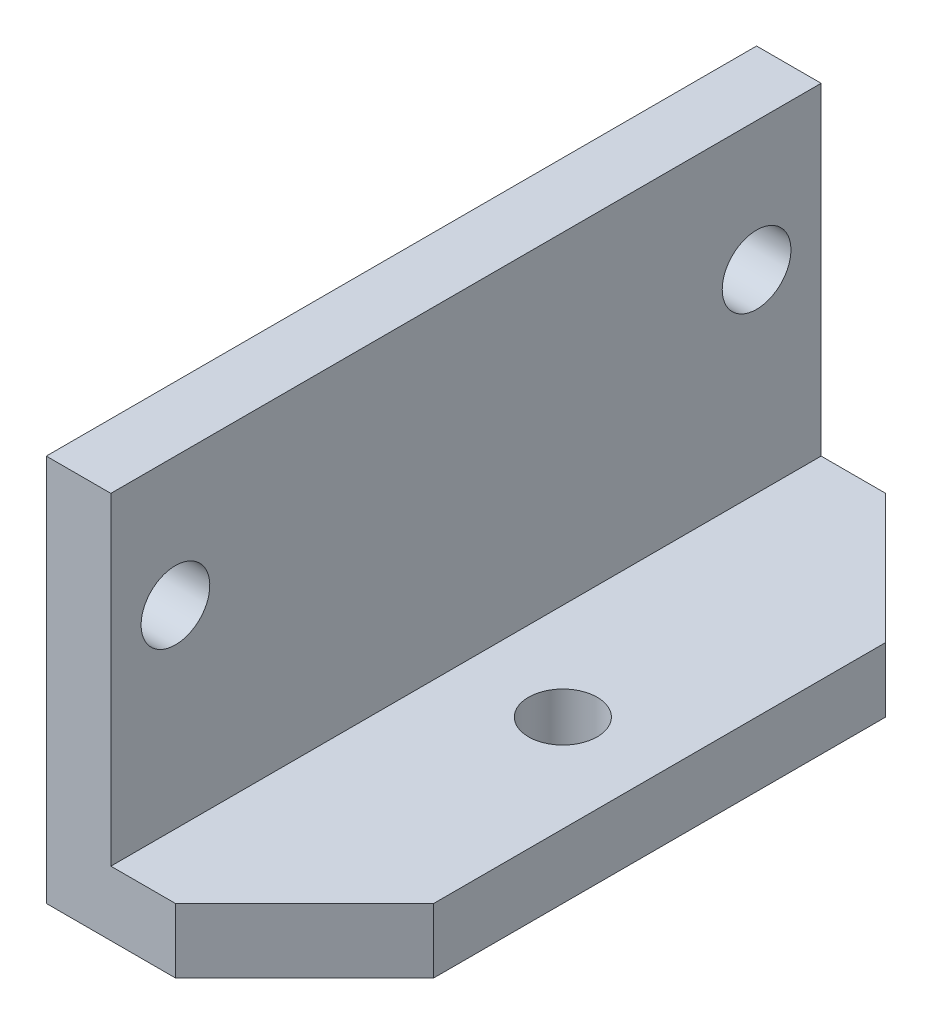
ISO-10303-21;
HEADER;
FILE_DESCRIPTION(('STEP AP214'),'2;1');
FILE_NAME('part.step','',(''),(''),'','','');
FILE_SCHEMA(('AUTOMOTIVE_DESIGN { 1 0 10303 214 1 1 1 1 }'));
ENDSEC;
DATA;
#1=APPLICATION_CONTEXT('core data for automotive mechanical design processes');
#2=APPLICATION_PROTOCOL_DEFINITION('international standard','automotive_design',2000,#1);
#3=PRODUCT_CONTEXT('',#1,'mechanical');
#4=PRODUCT('Part','Part','',(#3));
#5=PRODUCT_RELATED_PRODUCT_CATEGORY('part','',(#4));
#6=PRODUCT_DEFINITION_FORMATION('','',#4);
#7=PRODUCT_DEFINITION_CONTEXT('part definition',#1,'design');
#8=PRODUCT_DEFINITION('design','',#6,#7);
#9=PRODUCT_DEFINITION_SHAPE('','',#8);
#10=(LENGTH_UNIT() NAMED_UNIT(*) SI_UNIT(.MILLI.,.METRE.));
#11=(NAMED_UNIT(*) PLANE_ANGLE_UNIT() SI_UNIT($,.RADIAN.));
#12=(NAMED_UNIT(*) SI_UNIT($,.STERADIAN.) SOLID_ANGLE_UNIT());
#13=UNCERTAINTY_MEASURE_WITH_UNIT(LENGTH_MEASURE(1.E-05),#10,'distance_accuracy_value','');
#14=(GEOMETRIC_REPRESENTATION_CONTEXT(3) GLOBAL_UNCERTAINTY_ASSIGNED_CONTEXT((#13)) GLOBAL_UNIT_ASSIGNED_CONTEXT((#10,
#11,#12)) REPRESENTATION_CONTEXT('',''));
#15=CARTESIAN_POINT('',(0.,0.,0.));
#16=DIRECTION('',(0.,0.,1.));
#17=DIRECTION('',(1.,0.,0.));
#18=AXIS2_PLACEMENT_3D('',#15,#16,#17);
#19=CARTESIAN_POINT('',(6.35,38.1,34.925));
#20=DIRECTION('',(0.,-1.,0.));
#21=DIRECTION('',(0.,0.,-1.));
#22=AXIS2_PLACEMENT_3D('',#19,#20,#21);
#23=PLANE('',#22);
#24=DIRECTION('',(-1.,0.,0.));
#25=VECTOR('',#24,1.);
#26=CARTESIAN_POINT('',(6.35,38.1,-34.925));
#27=LINE('',#26,#25);
#28=CARTESIAN_POINT('',(6.35,38.1,-34.925));
#29=VERTEX_POINT('',#28);
#30=CARTESIAN_POINT('',(0.,38.1,-34.925));
#31=VERTEX_POINT('',#30);
#32=EDGE_CURVE('E154',#29,#31,#27,.T.);
#33=ORIENTED_EDGE('',*,*,#32,.T.);
#34=DIRECTION('',(0.,0.,-1.));
#35=VECTOR('',#34,1.);
#36=CARTESIAN_POINT('',(0.,38.1,34.925));
#37=LINE('',#36,#35);
#38=CARTESIAN_POINT('',(0.,38.1,34.925));
#39=VERTEX_POINT('',#38);
#40=EDGE_CURVE('E134',#39,#31,#37,.T.);
#41=ORIENTED_EDGE('',*,*,#40,.F.);
#42=DIRECTION('',(-1.,0.,0.));
#43=VECTOR('',#42,1.);
#44=CARTESIAN_POINT('',(6.35,38.1,34.925));
#45=LINE('',#44,#43);
#46=CARTESIAN_POINT('',(6.35,38.1,34.925));
#47=VERTEX_POINT('',#46);
#48=EDGE_CURVE('E141',#47,#39,#45,.T.);
#49=ORIENTED_EDGE('',*,*,#48,.F.);
#50=DIRECTION('',(0.,0.,-1.));
#51=VECTOR('',#50,1.);
#52=CARTESIAN_POINT('',(6.35,38.1,34.925));
#53=LINE('',#52,#51);
#54=EDGE_CURVE('E211',#47,#29,#53,.T.);
#55=ORIENTED_EDGE('',*,*,#54,.T.);
#56=EDGE_LOOP('',(#33,#41,#49,#55));
#57=FACE_BOUND('',#56,.T.);
#58=ADVANCED_FACE('F44',(#57),#23,.F.);
#59=CARTESIAN_POINT('',(0.,38.1,34.925));
#60=DIRECTION('',(1.,0.,0.));
#61=DIRECTION('',(0.,0.,-1.));
#62=AXIS2_PLACEMENT_3D('',#59,#60,#61);
#63=PLANE('',#62);
#64=CARTESIAN_POINT('',(0.,25.4,-28.575));
#65=DIRECTION('',(-1.,0.,0.));
#66=DIRECTION('',(0.,0.,1.));
#67=AXIS2_PLACEMENT_3D('',#64,#65,#66);
#68=CIRCLE('',#67,3.3782);
#69=CARTESIAN_POINT('',(0.,25.4,-25.1968));
#70=VERTEX_POINT('',#69);
#71=EDGE_CURVE('E221',#70,#70,#68,.T.);
#72=ORIENTED_EDGE('',*,*,#71,.F.);
#73=EDGE_LOOP('',(#72));
#74=FACE_BOUND('',#73,.T.);
#75=CARTESIAN_POINT('',(0.,25.4,28.575));
#76=DIRECTION('',(-1.,0.,0.));
#77=DIRECTION('',(0.,0.,1.));
#78=AXIS2_PLACEMENT_3D('',#75,#76,#77);
#79=CIRCLE('',#78,3.3782);
#80=CARTESIAN_POINT('',(0.,25.4,31.9532));
#81=VERTEX_POINT('',#80);
#82=EDGE_CURVE('E230',#81,#81,#79,.T.);
#83=ORIENTED_EDGE('',*,*,#82,.F.);
#84=EDGE_LOOP('',(#83));
#85=FACE_BOUND('',#84,.T.);
#86=DIRECTION('',(0.,-1.,0.));
#87=VECTOR('',#86,1.);
#88=CARTESIAN_POINT('',(0.,38.1,-34.925));
#89=LINE('',#88,#87);
#90=CARTESIAN_POINT('',(0.,0.,-34.925));
#91=VERTEX_POINT('',#90);
#92=EDGE_CURVE('E207',#31,#91,#89,.T.);
#93=ORIENTED_EDGE('',*,*,#92,.T.);
#94=DIRECTION('',(0.,0.,-1.));
#95=VECTOR('',#94,1.);
#96=CARTESIAN_POINT('',(0.,0.,34.925));
#97=LINE('',#96,#95);
#98=CARTESIAN_POINT('',(0.,0.,34.925));
#99=VERTEX_POINT('',#98);
#100=EDGE_CURVE('E137',#99,#91,#97,.T.);
#101=ORIENTED_EDGE('',*,*,#100,.F.);
#102=DIRECTION('',(0.,-1.,0.));
#103=VECTOR('',#102,1.);
#104=CARTESIAN_POINT('',(0.,38.1,34.925));
#105=LINE('',#104,#103);
#106=EDGE_CURVE('E130',#39,#99,#105,.T.);
#107=ORIENTED_EDGE('',*,*,#106,.F.);
#108=ORIENTED_EDGE('',*,*,#40,.T.);
#109=EDGE_LOOP('',(#93,#101,#107,#108));
#110=FACE_BOUND('',#109,.T.);
#111=ADVANCED_FACE('F132',(#74,#85,#110),#63,.F.);
#112=CARTESIAN_POINT('',(0.,0.,34.925));
#113=DIRECTION('',(0.,1.,0.));
#114=DIRECTION('',(0.,0.,1.));
#115=AXIS2_PLACEMENT_3D('',#112,#113,#114);
#116=PLANE('',#115);
#117=CARTESIAN_POINT('',(15.875,0.,0.));
#118=DIRECTION('',(0.,1.,0.));
#119=DIRECTION('',(0.,0.,1.));
#120=AXIS2_PLACEMENT_3D('',#117,#118,#119);
#121=CIRCLE('',#120,3.37819999999999);
#122=CARTESIAN_POINT('',(15.875,0.,3.37819999999999));
#123=VERTEX_POINT('',#122);
#124=EDGE_CURVE('E218',#123,#123,#121,.T.);
#125=ORIENTED_EDGE('',*,*,#124,.T.);
#126=EDGE_LOOP('',(#125));
#127=FACE_BOUND('',#126,.T.);
#128=DIRECTION('',(1.,0.,0.));
#129=VECTOR('',#128,1.);
#130=CARTESIAN_POINT('',(0.,0.,-34.925));
#131=LINE('',#130,#129);
#132=CARTESIAN_POINT('',(12.6999999999999,0.,-34.925));
#133=VERTEX_POINT('',#132);
#134=EDGE_CURVE('E185',#91,#133,#131,.T.);
#135=ORIENTED_EDGE('',*,*,#134,.T.);
#136=DIRECTION('',(-0.707106781186548,0.,-0.707106781186547));
#137=VECTOR('',#136,1.);
#138=CARTESIAN_POINT('',(25.4,0.,-22.225));
#139=LINE('',#138,#137);
#140=CARTESIAN_POINT('',(25.4,0.,-22.225));
#141=VERTEX_POINT('',#140);
#142=EDGE_CURVE('E53',#133,#141,#139,.F.);
#143=ORIENTED_EDGE('',*,*,#142,.T.);
#144=DIRECTION('',(0.,0.,-1.));
#145=VECTOR('',#144,1.);
#146=CARTESIAN_POINT('',(25.4,0.,34.925));
#147=LINE('',#146,#145);
#148=CARTESIAN_POINT('',(25.4,0.,22.225));
#149=VERTEX_POINT('',#148);
#150=EDGE_CURVE('E164',#149,#141,#147,.T.);
#151=ORIENTED_EDGE('',*,*,#150,.F.);
#152=DIRECTION('',(-0.707106781186546,0.,0.707106781186549));
#153=VECTOR('',#152,1.);
#154=CARTESIAN_POINT('',(12.7,0.,34.925));
#155=LINE('',#154,#153);
#156=CARTESIAN_POINT('',(12.7,0.,34.925));
#157=VERTEX_POINT('',#156);
#158=EDGE_CURVE('E63',#149,#157,#155,.T.);
#159=ORIENTED_EDGE('',*,*,#158,.T.);
#160=DIRECTION('',(1.,0.,0.));
#161=VECTOR('',#160,1.);
#162=CARTESIAN_POINT('',(0.,0.,34.925));
#163=LINE('',#162,#161);
#164=EDGE_CURVE('E140',#99,#157,#163,.T.);
#165=ORIENTED_EDGE('',*,*,#164,.F.);
#166=ORIENTED_EDGE('',*,*,#100,.T.);
#167=EDGE_LOOP('',(#135,#143,#151,#159,#165,#166));
#168=FACE_BOUND('',#167,.T.);
#169=ADVANCED_FACE('F184',(#127,#168),#116,.F.);
#170=CARTESIAN_POINT('',(25.4,0.,34.925));
#171=DIRECTION('',(-1.,0.,0.));
#172=DIRECTION('',(0.,-1.,0.));
#173=AXIS2_PLACEMENT_3D('',#170,#171,#172);
#174=PLANE('',#173);
#175=ORIENTED_EDGE('',*,*,#150,.T.);
#176=DIRECTION('',(0.,1.,0.));
#177=VECTOR('',#176,1.);
#178=CARTESIAN_POINT('',(25.4,0.,-22.225));
#179=LINE('',#178,#177);
#180=CARTESIAN_POINT('',(25.4,6.35,-22.225));
#181=VERTEX_POINT('',#180);
#182=EDGE_CURVE('E161',#141,#181,#179,.T.);
#183=ORIENTED_EDGE('',*,*,#182,.T.);
#184=DIRECTION('',(0.,0.,-1.));
#185=VECTOR('',#184,1.);
#186=CARTESIAN_POINT('',(25.4,6.35,34.925));
#187=LINE('',#186,#185);
#188=CARTESIAN_POINT('',(25.4,6.35,22.225));
#189=VERTEX_POINT('',#188);
#190=EDGE_CURVE('E194',#189,#181,#187,.T.);
#191=ORIENTED_EDGE('',*,*,#190,.F.);
#192=DIRECTION('',(0.,-1.,0.));
#193=VECTOR('',#192,1.);
#194=CARTESIAN_POINT('',(25.4,0.,22.225));
#195=LINE('',#194,#193);
#196=EDGE_CURVE('E156',#189,#149,#195,.T.);
#197=ORIENTED_EDGE('',*,*,#196,.T.);
#198=EDGE_LOOP('',(#175,#183,#191,#197));
#199=FACE_BOUND('',#198,.T.);
#200=ADVANCED_FACE('F189',(#199),#174,.F.);
#201=CARTESIAN_POINT('',(25.4,6.35,34.925));
#202=DIRECTION('',(0.,-1.,0.));
#203=DIRECTION('',(1.,0.,0.));
#204=AXIS2_PLACEMENT_3D('',#201,#202,#203);
#205=PLANE('',#204);
#206=CARTESIAN_POINT('',(15.875,6.35,0.));
#207=DIRECTION('',(0.,1.,0.));
#208=DIRECTION('',(0.,0.,1.));
#209=AXIS2_PLACEMENT_3D('',#206,#207,#208);
#210=CIRCLE('',#209,3.37819999999999);
#211=CARTESIAN_POINT('',(15.875,6.35,3.37819999999999));
#212=VERTEX_POINT('',#211);
#213=EDGE_CURVE('E222',#212,#212,#210,.T.);
#214=ORIENTED_EDGE('',*,*,#213,.F.);
#215=EDGE_LOOP('',(#214));
#216=FACE_BOUND('',#215,.T.);
#217=ORIENTED_EDGE('',*,*,#190,.T.);
#218=DIRECTION('',(0.707106781186548,0.,0.707106781186547));
#219=VECTOR('',#218,1.);
#220=CARTESIAN_POINT('',(25.4,6.35,-22.225));
#221=LINE('',#220,#219);
#222=CARTESIAN_POINT('',(12.6999999999999,6.35,-34.925));
#223=VERTEX_POINT('',#222);
#224=EDGE_CURVE('E174',#181,#223,#221,.F.);
#225=ORIENTED_EDGE('',*,*,#224,.T.);
#226=DIRECTION('',(-1.,0.,0.));
#227=VECTOR('',#226,1.);
#228=CARTESIAN_POINT('',(25.4,6.35,-34.925));
#229=LINE('',#228,#227);
#230=CARTESIAN_POINT('',(6.35,6.34999999999999,-34.925));
#231=VERTEX_POINT('',#230);
#232=EDGE_CURVE('E199',#223,#231,#229,.T.);
#233=ORIENTED_EDGE('',*,*,#232,.T.);
#234=DIRECTION('',(0.,0.,-1.));
#235=VECTOR('',#234,1.);
#236=CARTESIAN_POINT('',(6.35,6.34999999999999,34.925));
#237=LINE('',#236,#235);
#238=CARTESIAN_POINT('',(6.35,6.34999999999999,34.925));
#239=VERTEX_POINT('',#238);
#240=EDGE_CURVE('E214',#239,#231,#237,.T.);
#241=ORIENTED_EDGE('',*,*,#240,.F.);
#242=DIRECTION('',(-1.,0.,0.));
#243=VECTOR('',#242,1.);
#244=CARTESIAN_POINT('',(25.4,6.35,34.925));
#245=LINE('',#244,#243);
#246=CARTESIAN_POINT('',(12.7,6.35,34.925));
#247=VERTEX_POINT('',#246);
#248=EDGE_CURVE('E239',#247,#239,#245,.T.);
#249=ORIENTED_EDGE('',*,*,#248,.F.);
#250=DIRECTION('',(0.707106781186546,0.,-0.707106781186549));
#251=VECTOR('',#250,1.);
#252=CARTESIAN_POINT('',(12.7,6.35,34.925));
#253=LINE('',#252,#251);
#254=EDGE_CURVE('E171',#247,#189,#253,.T.);
#255=ORIENTED_EDGE('',*,*,#254,.T.);
#256=EDGE_LOOP('',(#217,#225,#233,#241,#249,#255));
#257=FACE_BOUND('',#256,.T.);
#258=ADVANCED_FACE('F197',(#216,#257),#205,.F.);
#259=CARTESIAN_POINT('',(6.35,6.34999999999999,34.925));
#260=DIRECTION('',(-1.,0.,0.));
#261=DIRECTION('',(0.,-1.,0.));
#262=AXIS2_PLACEMENT_3D('',#259,#260,#261);
#263=PLANE('',#262);
#264=CARTESIAN_POINT('',(6.35,25.4,-28.575));
#265=DIRECTION('',(-1.,0.,0.));
#266=DIRECTION('',(0.,-1.,0.));
#267=AXIS2_PLACEMENT_3D('',#264,#265,#266);
#268=CIRCLE('',#267,3.3782);
#269=CARTESIAN_POINT('',(6.35,22.0218,-28.575));
#270=VERTEX_POINT('',#269);
#271=EDGE_CURVE('E227',#270,#270,#268,.T.);
#272=ORIENTED_EDGE('',*,*,#271,.T.);
#273=EDGE_LOOP('',(#272));
#274=FACE_BOUND('',#273,.T.);
#275=CARTESIAN_POINT('',(6.35,25.4,28.575));
#276=DIRECTION('',(-1.,0.,0.));
#277=DIRECTION('',(0.,-1.,0.));
#278=AXIS2_PLACEMENT_3D('',#275,#276,#277);
#279=CIRCLE('',#278,3.3782);
#280=CARTESIAN_POINT('',(6.35,22.0218,28.575));
#281=VERTEX_POINT('',#280);
#282=EDGE_CURVE('E225',#281,#281,#279,.T.);
#283=ORIENTED_EDGE('',*,*,#282,.T.);
#284=EDGE_LOOP('',(#283));
#285=FACE_BOUND('',#284,.T.);
#286=DIRECTION('',(0.,1.,0.));
#287=VECTOR('',#286,1.);
#288=CARTESIAN_POINT('',(6.35,6.34999999999999,-34.925));
#289=LINE('',#288,#287);
#290=EDGE_CURVE('E151',#231,#29,#289,.T.);
#291=ORIENTED_EDGE('',*,*,#290,.T.);
#292=ORIENTED_EDGE('',*,*,#54,.F.);
#293=DIRECTION('',(0.,1.,0.));
#294=VECTOR('',#293,1.);
#295=CARTESIAN_POINT('',(6.35,6.34999999999999,34.925));
#296=LINE('',#295,#294);
#297=EDGE_CURVE('E146',#239,#47,#296,.T.);
#298=ORIENTED_EDGE('',*,*,#297,.F.);
#299=ORIENTED_EDGE('',*,*,#240,.T.);
#300=EDGE_LOOP('',(#291,#292,#298,#299));
#301=FACE_BOUND('',#300,.T.);
#302=ADVANCED_FACE('F290',(#274,#285,#301),#263,.F.);
#303=CARTESIAN_POINT('',(0.,0.,34.925));
#304=DIRECTION('',(0.,0.,1.));
#305=DIRECTION('',(1.,0.,0.));
#306=AXIS2_PLACEMENT_3D('',#303,#304,#305);
#307=PLANE('',#306);
#308=ORIENTED_EDGE('',*,*,#164,.T.);
#309=DIRECTION('',(0.,1.,0.));
#310=VECTOR('',#309,1.);
#311=CARTESIAN_POINT('',(12.7,6.34999999999999,34.925));
#312=LINE('',#311,#310);
#313=EDGE_CURVE('E11',#157,#247,#312,.T.);
#314=ORIENTED_EDGE('',*,*,#313,.T.);
#315=ORIENTED_EDGE('',*,*,#248,.T.);
#316=ORIENTED_EDGE('',*,*,#297,.T.);
#317=ORIENTED_EDGE('',*,*,#48,.T.);
#318=ORIENTED_EDGE('',*,*,#106,.T.);
#319=EDGE_LOOP('',(#308,#314,#315,#316,#317,#318));
#320=FACE_BOUND('',#319,.T.);
#321=ADVANCED_FACE('F144',(#320),#307,.T.);
#322=CARTESIAN_POINT('',(0.,0.,-34.925));
#323=DIRECTION('',(0.,0.,1.));
#324=DIRECTION('',(1.,0.,0.));
#325=AXIS2_PLACEMENT_3D('',#322,#323,#324);
#326=PLANE('',#325);
#327=ORIENTED_EDGE('',*,*,#232,.F.);
#328=DIRECTION('',(0.,-1.,0.));
#329=VECTOR('',#328,1.);
#330=CARTESIAN_POINT('',(12.6999999999999,0.,-34.925));
#331=LINE('',#330,#329);
#332=EDGE_CURVE('E74',#223,#133,#331,.T.);
#333=ORIENTED_EDGE('',*,*,#332,.T.);
#334=ORIENTED_EDGE('',*,*,#134,.F.);
#335=ORIENTED_EDGE('',*,*,#92,.F.);
#336=ORIENTED_EDGE('',*,*,#32,.F.);
#337=ORIENTED_EDGE('',*,*,#290,.F.);
#338=EDGE_LOOP('',(#327,#333,#334,#335,#336,#337));
#339=FACE_BOUND('',#338,.T.);
#340=ADVANCED_FACE('F202',(#339),#326,.F.);
#341=CARTESIAN_POINT('',(0.,25.4,28.575));
#342=DIRECTION('',(-1.,0.,0.));
#343=DIRECTION('',(0.,0.,1.));
#344=AXIS2_PLACEMENT_3D('',#341,#342,#343);
#345=CYLINDRICAL_SURFACE('',#344,3.3782);
#346=ORIENTED_EDGE('',*,*,#82,.T.);
#347=EDGE_LOOP('',(#346));
#348=FACE_BOUND('',#347,.T.);
#349=ORIENTED_EDGE('',*,*,#282,.F.);
#350=EDGE_LOOP('',(#349));
#351=FACE_BOUND('',#350,.T.);
#352=ADVANCED_FACE('F253',(#348,#351),#345,.F.);
#353=CARTESIAN_POINT('',(0.,25.4,-28.575));
#354=DIRECTION('',(-1.,0.,0.));
#355=DIRECTION('',(0.,0.,1.));
#356=AXIS2_PLACEMENT_3D('',#353,#354,#355);
#357=CYLINDRICAL_SURFACE('',#356,3.3782);
#358=ORIENTED_EDGE('',*,*,#71,.T.);
#359=EDGE_LOOP('',(#358));
#360=FACE_BOUND('',#359,.T.);
#361=ORIENTED_EDGE('',*,*,#271,.F.);
#362=EDGE_LOOP('',(#361));
#363=FACE_BOUND('',#362,.T.);
#364=ADVANCED_FACE('F275',(#360,#363),#357,.F.);
#365=CARTESIAN_POINT('',(15.875,6.35,0.));
#366=DIRECTION('',(0.,1.,0.));
#367=DIRECTION('',(0.,0.,1.));
#368=AXIS2_PLACEMENT_3D('',#365,#366,#367);
#369=CYLINDRICAL_SURFACE('',#368,3.37819999999999);
#370=ORIENTED_EDGE('',*,*,#124,.F.);
#371=EDGE_LOOP('',(#370));
#372=FACE_BOUND('',#371,.T.);
#373=ORIENTED_EDGE('',*,*,#213,.T.);
#374=EDGE_LOOP('',(#373));
#375=FACE_BOUND('',#374,.T.);
#376=ADVANCED_FACE('F269',(#372,#375),#369,.F.);
#377=CARTESIAN_POINT('',(25.4,0.,-22.225));
#378=DIRECTION('',(-0.707106781186547,0.,0.707106781186548));
#379=DIRECTION('',(0.,1.,0.));
#380=AXIS2_PLACEMENT_3D('',#377,#378,#379);
#381=PLANE('',#380);
#382=ORIENTED_EDGE('',*,*,#142,.F.);
#383=ORIENTED_EDGE('',*,*,#332,.F.);
#384=ORIENTED_EDGE('',*,*,#224,.F.);
#385=ORIENTED_EDGE('',*,*,#182,.F.);
#386=EDGE_LOOP('',(#382,#383,#384,#385));
#387=FACE_BOUND('',#386,.T.);
#388=ADVANCED_FACE('F195',(#387),#381,.F.);
#389=CARTESIAN_POINT('',(12.7,0.,34.925));
#390=DIRECTION('',(0.707106781186549,0.,0.707106781186546));
#391=DIRECTION('',(0.,-1.,0.));
#392=AXIS2_PLACEMENT_3D('',#389,#390,#391);
#393=PLANE('',#392);
#394=ORIENTED_EDGE('',*,*,#158,.F.);
#395=ORIENTED_EDGE('',*,*,#196,.F.);
#396=ORIENTED_EDGE('',*,*,#254,.F.);
#397=ORIENTED_EDGE('',*,*,#313,.F.);
#398=EDGE_LOOP('',(#394,#395,#396,#397));
#399=FACE_BOUND('',#398,.T.);
#400=ADVANCED_FACE('F46',(#399),#393,.T.);
#401=CLOSED_SHELL('',(#58,#111,#169,#200,#258,#302,#321,#340,#352,#364,#376,#388,#400));
#402=MANIFOLD_SOLID_BREP('B2',#401);
#403=ADVANCED_BREP_SHAPE_REPRESENTATION('',(#18,#402),#14);
#404=SHAPE_DEFINITION_REPRESENTATION(#9,#403);
ENDSEC;
END-ISO-10303-21;
